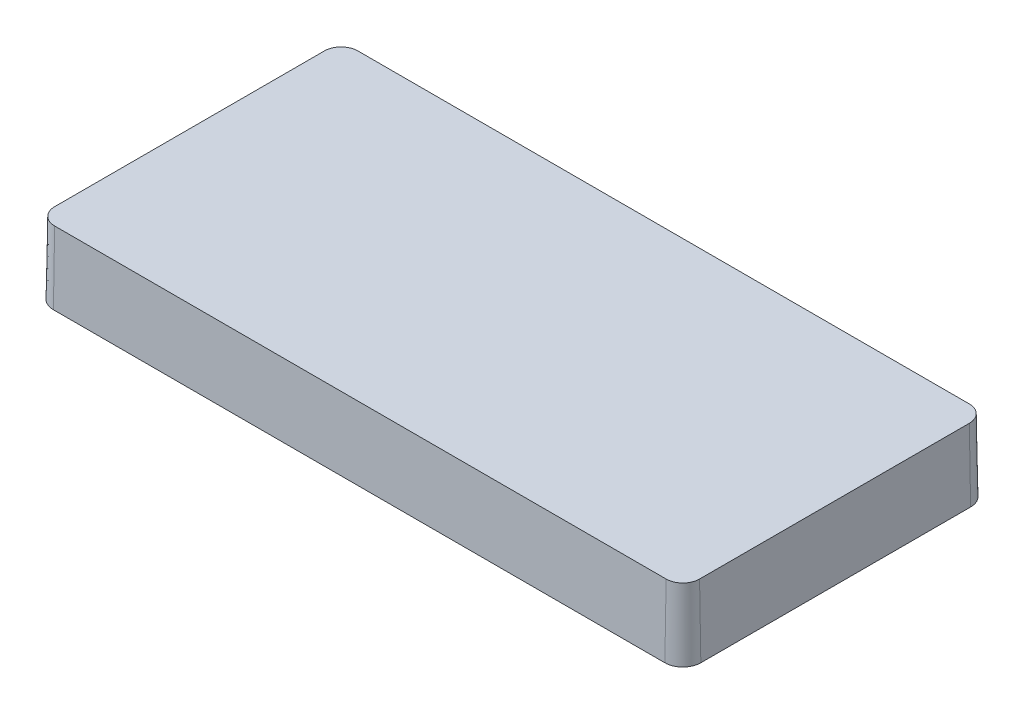
ISO-10303-21;
HEADER;
FILE_DESCRIPTION(('STEP AP214'),'2;1');
FILE_NAME('part.step','',(''),(''),'','','');
FILE_SCHEMA(('AUTOMOTIVE_DESIGN { 1 0 10303 214 1 1 1 1 }'));
ENDSEC;
DATA;
#1=APPLICATION_CONTEXT('core data for automotive mechanical design processes');
#2=APPLICATION_PROTOCOL_DEFINITION('international standard','automotive_design',2000,#1);
#3=PRODUCT_CONTEXT('',#1,'mechanical');
#4=PRODUCT('Part','Part','',(#3));
#5=PRODUCT_RELATED_PRODUCT_CATEGORY('part','',(#4));
#6=PRODUCT_DEFINITION_FORMATION('','',#4);
#7=PRODUCT_DEFINITION_CONTEXT('part definition',#1,'design');
#8=PRODUCT_DEFINITION('design','',#6,#7);
#9=PRODUCT_DEFINITION_SHAPE('','',#8);
#10=(LENGTH_UNIT() NAMED_UNIT(*) SI_UNIT(.MILLI.,.METRE.));
#11=(NAMED_UNIT(*) PLANE_ANGLE_UNIT() SI_UNIT($,.RADIAN.));
#12=(NAMED_UNIT(*) SI_UNIT($,.STERADIAN.) SOLID_ANGLE_UNIT());
#13=UNCERTAINTY_MEASURE_WITH_UNIT(LENGTH_MEASURE(1.E-05),#10,'distance_accuracy_value','');
#14=(GEOMETRIC_REPRESENTATION_CONTEXT(3) GLOBAL_UNCERTAINTY_ASSIGNED_CONTEXT((#13)) GLOBAL_UNIT_ASSIGNED_CONTEXT((#10,
#11,#12)) REPRESENTATION_CONTEXT('',''));
#15=CARTESIAN_POINT('',(0.,0.,0.));
#16=DIRECTION('',(0.,0.,1.));
#17=DIRECTION('',(1.,0.,0.));
#18=AXIS2_PLACEMENT_3D('',#15,#16,#17);
#19=CARTESIAN_POINT('',(-17.,3.5,-7.5));
#20=DIRECTION('',(0.,-1.,0.));
#21=DIRECTION('',(0.,0.,-1.));
#22=AXIS2_PLACEMENT_3D('',#19,#20,#21);
#23=PLANE('',#22);
#24=DIRECTION('',(0.,0.,1.));
#25=VECTOR('',#24,1.);
#26=CARTESIAN_POINT('',(-0.6,3.5,2.93938769133981));
#27=LINE('',#26,#25);
#28=CARTESIAN_POINT('',(-0.599999999999999,3.5,0.6));
#29=VERTEX_POINT('',#28);
#30=CARTESIAN_POINT('',(-0.6,3.5,2.93938769133981));
#31=VERTEX_POINT('',#30);
#32=EDGE_CURVE('E596',#29,#31,#27,.T.);
#33=ORIENTED_EDGE('',*,*,#32,.F.);
#34=DIRECTION('',(1.,0.,0.));
#35=VECTOR('',#34,1.);
#36=CARTESIAN_POINT('',(-2.93938769133981,3.5,0.6));
#37=LINE('',#36,#35);
#38=CARTESIAN_POINT('',(-2.93938769133981,3.5,0.600000000000001));
#39=VERTEX_POINT('',#38);
#40=EDGE_CURVE('E330',#39,#29,#37,.T.);
#41=ORIENTED_EDGE('',*,*,#40,.F.);
#42=CARTESIAN_POINT('',(0.,3.5,0.));
#43=DIRECTION('',(0.,-1.,0.));
#44=DIRECTION('',(0.,0.,-1.));
#45=AXIS2_PLACEMENT_3D('',#42,#43,#44);
#46=CIRCLE('',#45,3.);
#47=EDGE_CURVE('E593',#31,#39,#46,.T.);
#48=ORIENTED_EDGE('',*,*,#47,.F.);
#49=EDGE_LOOP('',(#33,#41,#48));
#50=FACE_BOUND('',#49,.T.);
#51=CARTESIAN_POINT('',(-17.,3.5,-7.5));
#52=DIRECTION('',(0.,-1.,0.));
#53=DIRECTION('',(0.,0.,-1.));
#54=AXIS2_PLACEMENT_3D('',#51,#52,#53);
#55=CIRCLE('',#54,0.438831108729285);
#56=CARTESIAN_POINT('',(-17.,3.5,-7.93883110872928));
#57=VERTEX_POINT('',#56);
#58=CARTESIAN_POINT('',(-17.4388311087293,3.5,-7.5));
#59=VERTEX_POINT('',#58);
#60=EDGE_CURVE('E557',#57,#59,#55,.F.);
#61=ORIENTED_EDGE('',*,*,#60,.F.);
#62=DIRECTION('',(1.,0.,0.));
#63=VECTOR('',#62,1.);
#64=CARTESIAN_POINT('',(-17.,3.5,-7.93883110872928));
#65=LINE('',#64,#63);
#66=CARTESIAN_POINT('',(17.,3.5,-7.93883110872928));
#67=VERTEX_POINT('',#66);
#68=EDGE_CURVE('E560',#67,#57,#65,.F.);
#69=ORIENTED_EDGE('',*,*,#68,.F.);
#70=CARTESIAN_POINT('',(17.,3.5,-7.5));
#71=DIRECTION('',(0.,-1.,0.));
#72=DIRECTION('',(0.,0.,-1.));
#73=AXIS2_PLACEMENT_3D('',#70,#71,#72);
#74=CIRCLE('',#73,0.438831108729287);
#75=CARTESIAN_POINT('',(17.4388311087293,3.5,-7.5));
#76=VERTEX_POINT('',#75);
#77=EDGE_CURVE('E563',#76,#67,#74,.F.);
#78=ORIENTED_EDGE('',*,*,#77,.F.);
#79=DIRECTION('',(0.,0.,1.));
#80=VECTOR('',#79,1.);
#81=CARTESIAN_POINT('',(17.4388311087293,3.5,-7.5));
#82=LINE('',#81,#80);
#83=CARTESIAN_POINT('',(17.4388311087293,3.5,7.5));
#84=VERTEX_POINT('',#83);
#85=EDGE_CURVE('E565',#84,#76,#82,.F.);
#86=ORIENTED_EDGE('',*,*,#85,.F.);
#87=CARTESIAN_POINT('',(17.,3.5,7.5));
#88=DIRECTION('',(0.,-1.,0.));
#89=DIRECTION('',(0.,0.,-1.));
#90=AXIS2_PLACEMENT_3D('',#87,#88,#89);
#91=CIRCLE('',#90,0.438831108729286);
#92=CARTESIAN_POINT('',(17.,3.5,7.93883110872929));
#93=VERTEX_POINT('',#92);
#94=EDGE_CURVE('E570',#93,#84,#91,.F.);
#95=ORIENTED_EDGE('',*,*,#94,.F.);
#96=DIRECTION('',(-1.,0.,0.));
#97=VECTOR('',#96,1.);
#98=CARTESIAN_POINT('',(-17.,3.5,7.93883110872929));
#99=LINE('',#98,#97);
#100=CARTESIAN_POINT('',(-17.,3.5,7.93883110872929));
#101=VERTEX_POINT('',#100);
#102=EDGE_CURVE('E574',#101,#93,#99,.F.);
#103=ORIENTED_EDGE('',*,*,#102,.F.);
#104=CARTESIAN_POINT('',(-17.,3.5,7.5));
#105=DIRECTION('',(0.,-1.,0.));
#106=DIRECTION('',(0.,0.,-1.));
#107=AXIS2_PLACEMENT_3D('',#104,#105,#106);
#108=CIRCLE('',#107,0.438831108729284);
#109=CARTESIAN_POINT('',(-17.4388311087293,3.5,7.5));
#110=VERTEX_POINT('',#109);
#111=EDGE_CURVE('E578',#110,#101,#108,.F.);
#112=ORIENTED_EDGE('',*,*,#111,.F.);
#113=DIRECTION('',(0.,0.,-1.));
#114=VECTOR('',#113,1.);
#115=CARTESIAN_POINT('',(-17.4388311087293,3.5,-7.5));
#116=LINE('',#115,#114);
#117=EDGE_CURVE('E582',#59,#110,#116,.F.);
#118=ORIENTED_EDGE('',*,*,#117,.F.);
#119=EDGE_LOOP('',(#61,#69,#78,#86,#95,#103,#112,#118));
#120=FACE_BOUND('',#119,.T.);
#121=DIRECTION('',(0.,0.,1.));
#122=VECTOR('',#121,1.);
#123=CARTESIAN_POINT('',(-0.599999999999999,3.5,-0.6));
#124=LINE('',#123,#122);
#125=CARTESIAN_POINT('',(-0.6,3.5,-2.93938769133981));
#126=VERTEX_POINT('',#125);
#127=CARTESIAN_POINT('',(-0.6,3.5,-0.6));
#128=VERTEX_POINT('',#127);
#129=EDGE_CURVE('E611',#126,#128,#124,.T.);
#130=ORIENTED_EDGE('',*,*,#129,.F.);
#131=CARTESIAN_POINT('',(0.,3.5,0.));
#132=DIRECTION('',(0.,-1.,0.));
#133=DIRECTION('',(0.,0.,-1.));
#134=AXIS2_PLACEMENT_3D('',#131,#132,#133);
#135=CIRCLE('',#134,3.);
#136=CARTESIAN_POINT('',(-2.93938769133981,3.5,-0.6));
#137=VERTEX_POINT('',#136);
#138=EDGE_CURVE('E294',#137,#126,#135,.T.);
#139=ORIENTED_EDGE('',*,*,#138,.F.);
#140=DIRECTION('',(-1.,0.,0.));
#141=VECTOR('',#140,1.);
#142=CARTESIAN_POINT('',(-2.93938769133981,3.5,-0.6));
#143=LINE('',#142,#141);
#144=EDGE_CURVE('E332',#128,#137,#143,.T.);
#145=ORIENTED_EDGE('',*,*,#144,.F.);
#146=EDGE_LOOP('',(#130,#139,#145));
#147=FACE_BOUND('',#146,.T.);
#148=DIRECTION('',(0.,0.,-1.));
#149=VECTOR('',#148,1.);
#150=CARTESIAN_POINT('',(0.6,3.5,2.93938769133981));
#151=LINE('',#150,#149);
#152=CARTESIAN_POINT('',(0.6,3.5,2.93938769133981));
#153=VERTEX_POINT('',#152);
#154=CARTESIAN_POINT('',(0.6,3.5,0.600000000000001));
#155=VERTEX_POINT('',#154);
#156=EDGE_CURVE('E626',#153,#155,#151,.T.);
#157=ORIENTED_EDGE('',*,*,#156,.F.);
#158=CARTESIAN_POINT('',(0.,3.5,0.));
#159=DIRECTION('',(0.,-1.,0.));
#160=DIRECTION('',(0.,0.,-1.));
#161=AXIS2_PLACEMENT_3D('',#158,#159,#160);
#162=CIRCLE('',#161,3.);
#163=CARTESIAN_POINT('',(2.93938769133981,3.5,0.6));
#164=VERTEX_POINT('',#163);
#165=EDGE_CURVE('E236',#164,#153,#162,.T.);
#166=ORIENTED_EDGE('',*,*,#165,.F.);
#167=DIRECTION('',(1.,0.,0.));
#168=VECTOR('',#167,1.);
#169=CARTESIAN_POINT('',(0.599999999999999,3.5,0.6));
#170=LINE('',#169,#168);
#171=EDGE_CURVE('E295',#155,#164,#170,.T.);
#172=ORIENTED_EDGE('',*,*,#171,.F.);
#173=EDGE_LOOP('',(#157,#166,#172));
#174=FACE_BOUND('',#173,.T.);
#175=DIRECTION('',(-1.,0.,0.));
#176=VECTOR('',#175,1.);
#177=CARTESIAN_POINT('',(0.599999999999999,3.5,-0.6));
#178=LINE('',#177,#176);
#179=CARTESIAN_POINT('',(2.93938769133981,3.5,-0.6));
#180=VERTEX_POINT('',#179);
#181=CARTESIAN_POINT('',(0.600000000000001,3.5,-0.6));
#182=VERTEX_POINT('',#181);
#183=EDGE_CURVE('E230',#180,#182,#178,.T.);
#184=ORIENTED_EDGE('',*,*,#183,.F.);
#185=CARTESIAN_POINT('',(0.,3.5,0.));
#186=DIRECTION('',(0.,-1.,0.));
#187=DIRECTION('',(0.,0.,-1.));
#188=AXIS2_PLACEMENT_3D('',#185,#186,#187);
#189=CIRCLE('',#188,3.);
#190=CARTESIAN_POINT('',(0.6,3.5,-2.93938769133981));
#191=VERTEX_POINT('',#190);
#192=EDGE_CURVE('E240',#191,#180,#189,.T.);
#193=ORIENTED_EDGE('',*,*,#192,.F.);
#194=DIRECTION('',(0.,0.,-1.));
#195=VECTOR('',#194,1.);
#196=CARTESIAN_POINT('',(0.599999999999999,3.5,-0.6));
#197=LINE('',#196,#195);
#198=EDGE_CURVE('E246',#182,#191,#197,.T.);
#199=ORIENTED_EDGE('',*,*,#198,.F.);
#200=EDGE_LOOP('',(#184,#193,#199));
#201=FACE_BOUND('',#200,.T.);
#202=ADVANCED_FACE('F38',(#50,#120,#147,#174,#201),#23,.T.);
#203=CARTESIAN_POINT('',(-17.,0.,-7.5));
#204=DIRECTION('',(0.,-1.,0.));
#205=DIRECTION('',(0.,0.,-1.));
#206=AXIS2_PLACEMENT_3D('',#203,#204,#205);
#207=PLANE('',#206);
#208=CARTESIAN_POINT('',(-17.,0.,-7.5));
#209=DIRECTION('',(0.,1.,0.));
#210=DIRECTION('',(0.,0.,-1.));
#211=AXIS2_PLACEMENT_3D('',#208,#209,#210);
#212=CIRCLE('',#211,1.);
#213=CARTESIAN_POINT('',(-17.,0.,-8.5));
#214=VERTEX_POINT('',#213);
#215=CARTESIAN_POINT('',(-18.,0.,-7.5));
#216=VERTEX_POINT('',#215);
#217=EDGE_CURVE('E523',#214,#216,#212,.T.);
#218=ORIENTED_EDGE('',*,*,#217,.F.);
#219=DIRECTION('',(-1.,0.,0.));
#220=VECTOR('',#219,1.);
#221=CARTESIAN_POINT('',(-17.,0.,-8.5));
#222=LINE('',#221,#220);
#223=CARTESIAN_POINT('',(17.,0.,-8.5));
#224=VERTEX_POINT('',#223);
#225=EDGE_CURVE('E487',#224,#214,#222,.T.);
#226=ORIENTED_EDGE('',*,*,#225,.F.);
#227=CARTESIAN_POINT('',(17.,0.,-7.5));
#228=DIRECTION('',(0.,1.,0.));
#229=DIRECTION('',(0.,0.,1.));
#230=AXIS2_PLACEMENT_3D('',#227,#228,#229);
#231=CIRCLE('',#230,1.);
#232=CARTESIAN_POINT('',(18.,0.,-7.5));
#233=VERTEX_POINT('',#232);
#234=EDGE_CURVE('E485',#233,#224,#231,.T.);
#235=ORIENTED_EDGE('',*,*,#234,.F.);
#236=DIRECTION('',(0.,0.,-1.));
#237=VECTOR('',#236,1.);
#238=CARTESIAN_POINT('',(18.,0.,7.5));
#239=LINE('',#238,#237);
#240=CARTESIAN_POINT('',(18.,0.,7.5));
#241=VERTEX_POINT('',#240);
#242=EDGE_CURVE('E480',#241,#233,#239,.T.);
#243=ORIENTED_EDGE('',*,*,#242,.F.);
#244=CARTESIAN_POINT('',(17.,0.,7.5));
#245=DIRECTION('',(0.,1.,0.));
#246=DIRECTION('',(0.,0.,-1.));
#247=AXIS2_PLACEMENT_3D('',#244,#245,#246);
#248=CIRCLE('',#247,1.);
#249=CARTESIAN_POINT('',(17.,0.,8.5));
#250=VERTEX_POINT('',#249);
#251=EDGE_CURVE('E478',#250,#241,#248,.T.);
#252=ORIENTED_EDGE('',*,*,#251,.F.);
#253=DIRECTION('',(1.,0.,0.));
#254=VECTOR('',#253,1.);
#255=CARTESIAN_POINT('',(-17.,0.,8.5));
#256=LINE('',#255,#254);
#257=CARTESIAN_POINT('',(-17.,0.,8.5));
#258=VERTEX_POINT('',#257);
#259=EDGE_CURVE('E466',#258,#250,#256,.T.);
#260=ORIENTED_EDGE('',*,*,#259,.F.);
#261=CARTESIAN_POINT('',(-17.,0.,7.5));
#262=DIRECTION('',(0.,1.,0.));
#263=DIRECTION('',(0.,0.,-1.));
#264=AXIS2_PLACEMENT_3D('',#261,#262,#263);
#265=CIRCLE('',#264,1.);
#266=CARTESIAN_POINT('',(-18.,0.,7.5));
#267=VERTEX_POINT('',#266);
#268=EDGE_CURVE('E459',#267,#258,#265,.T.);
#269=ORIENTED_EDGE('',*,*,#268,.F.);
#270=DIRECTION('',(0.,0.,1.));
#271=VECTOR('',#270,1.);
#272=CARTESIAN_POINT('',(-18.,0.,7.5));
#273=LINE('',#272,#271);
#274=EDGE_CURVE('E467',#216,#267,#273,.T.);
#275=ORIENTED_EDGE('',*,*,#274,.F.);
#276=EDGE_LOOP('',(#218,#226,#235,#243,#252,#260,#269,#275));
#277=FACE_BOUND('',#276,.T.);
#278=DIRECTION('',(1.,0.,0.));
#279=VECTOR('',#278,1.);
#280=CARTESIAN_POINT('',(-17.,0.,-7.99992383597804));
#281=LINE('',#280,#279);
#282=CARTESIAN_POINT('',(17.,0.,-7.99992383597804));
#283=VERTEX_POINT('',#282);
#284=CARTESIAN_POINT('',(-17.,0.,-7.99992383597804));
#285=VERTEX_POINT('',#284);
#286=EDGE_CURVE('E554',#283,#285,#281,.F.);
#287=ORIENTED_EDGE('',*,*,#286,.T.);
#288=CARTESIAN_POINT('',(-17.,0.,-7.5));
#289=DIRECTION('',(0.,-1.,0.));
#290=DIRECTION('',(0.,0.,-1.));
#291=AXIS2_PLACEMENT_3D('',#288,#289,#290);
#292=CIRCLE('',#291,0.499923835978047);
#293=CARTESIAN_POINT('',(-17.499923835978,0.,-7.5));
#294=VERTEX_POINT('',#293);
#295=EDGE_CURVE('E539',#285,#294,#292,.F.);
#296=ORIENTED_EDGE('',*,*,#295,.T.);
#297=DIRECTION('',(0.,0.,-1.));
#298=VECTOR('',#297,1.);
#299=CARTESIAN_POINT('',(-17.499923835978,0.,-7.5));
#300=LINE('',#299,#298);
#301=CARTESIAN_POINT('',(-17.499923835978,0.,7.5));
#302=VERTEX_POINT('',#301);
#303=EDGE_CURVE('E535',#294,#302,#300,.F.);
#304=ORIENTED_EDGE('',*,*,#303,.T.);
#305=CARTESIAN_POINT('',(-17.,0.,7.5));
#306=DIRECTION('',(0.,-1.,0.));
#307=DIRECTION('',(0.,0.,-1.));
#308=AXIS2_PLACEMENT_3D('',#305,#306,#307);
#309=CIRCLE('',#308,0.499923835978046);
#310=CARTESIAN_POINT('',(-17.,0.,7.99992383597805));
#311=VERTEX_POINT('',#310);
#312=EDGE_CURVE('E538',#302,#311,#309,.F.);
#313=ORIENTED_EDGE('',*,*,#312,.T.);
#314=DIRECTION('',(-1.,0.,0.));
#315=VECTOR('',#314,1.);
#316=CARTESIAN_POINT('',(-17.,0.,7.99992383597805));
#317=LINE('',#316,#315);
#318=CARTESIAN_POINT('',(17.,0.,7.99992383597805));
#319=VERTEX_POINT('',#318);
#320=EDGE_CURVE('E542',#311,#319,#317,.F.);
#321=ORIENTED_EDGE('',*,*,#320,.T.);
#322=CARTESIAN_POINT('',(17.,0.,7.5));
#323=DIRECTION('',(0.,-1.,0.));
#324=DIRECTION('',(0.,0.,-1.));
#325=AXIS2_PLACEMENT_3D('',#322,#323,#324);
#326=CIRCLE('',#325,0.499923835978048);
#327=CARTESIAN_POINT('',(17.499923835978,0.,7.5));
#328=VERTEX_POINT('',#327);
#329=EDGE_CURVE('E545',#319,#328,#326,.F.);
#330=ORIENTED_EDGE('',*,*,#329,.T.);
#331=DIRECTION('',(0.,0.,1.));
#332=VECTOR('',#331,1.);
#333=CARTESIAN_POINT('',(17.499923835978,0.,-7.5));
#334=LINE('',#333,#332);
#335=CARTESIAN_POINT('',(17.499923835978,0.,-7.5));
#336=VERTEX_POINT('',#335);
#337=EDGE_CURVE('E548',#328,#336,#334,.F.);
#338=ORIENTED_EDGE('',*,*,#337,.T.);
#339=CARTESIAN_POINT('',(17.,0.,-7.5));
#340=DIRECTION('',(0.,-1.,0.));
#341=DIRECTION('',(0.,0.,-1.));
#342=AXIS2_PLACEMENT_3D('',#339,#340,#341);
#343=CIRCLE('',#342,0.499923835978049);
#344=EDGE_CURVE('E551',#336,#283,#343,.F.);
#345=ORIENTED_EDGE('',*,*,#344,.T.);
#346=EDGE_LOOP('',(#287,#296,#304,#313,#321,#330,#338,#345));
#347=FACE_BOUND('',#346,.T.);
#348=ADVANCED_FACE('F419',(#277,#347),#207,.T.);
#349=CARTESIAN_POINT('',(-17.,0.,-7.5));
#350=DIRECTION('',(0.,-1.,0.));
#351=DIRECTION('',(0.,0.,-1.));
#352=AXIS2_PLACEMENT_3D('',#349,#350,#351);
#353=CONICAL_SURFACE('',#352,1.,0.0174532925199433);
#354=ORIENTED_EDGE('',*,*,#217,.T.);
#355=DIRECTION('',(-0.0174524064372835,-0.999847695156391,0.));
#356=VECTOR('',#355,1.);
#357=CARTESIAN_POINT('',(-18.,0.,-7.5));
#358=LINE('',#357,#356);
#359=CARTESIAN_POINT('',(-17.9301797402871,4.,-7.5));
#360=VERTEX_POINT('',#359);
#361=EDGE_CURVE('E11',#360,#216,#358,.T.);
#362=ORIENTED_EDGE('',*,*,#361,.F.);
#363=CARTESIAN_POINT('',(-17.,4.,-7.5));
#364=DIRECTION('',(0.,-1.,0.));
#365=DIRECTION('',(0.,0.,-1.));
#366=AXIS2_PLACEMENT_3D('',#363,#364,#365);
#367=CIRCLE('',#366,0.93017974028713);
#368=CARTESIAN_POINT('',(-17.,4.,-8.43017974028713));
#369=VERTEX_POINT('',#368);
#370=EDGE_CURVE('E488',#369,#360,#367,.F.);
#371=ORIENTED_EDGE('',*,*,#370,.F.);
#372=DIRECTION('',(0.,-0.999847695156391,-0.0174524064372835));
#373=VECTOR('',#372,1.);
#374=CARTESIAN_POINT('',(-17.,0.,-8.5));
#375=LINE('',#374,#373);
#376=EDGE_CURVE('E490',#369,#214,#375,.T.);
#377=ORIENTED_EDGE('',*,*,#376,.T.);
#378=EDGE_LOOP('',(#354,#362,#371,#377));
#379=FACE_BOUND('',#378,.T.);
#380=ADVANCED_FACE('F427',(#379),#353,.T.);
#381=CARTESIAN_POINT('',(-18.,0.,7.5));
#382=DIRECTION('',(-0.999847695156391,0.0174524064372835,0.));
#383=DIRECTION('',(-0.0174524064372836,-0.999847695156391,0.));
#384=AXIS2_PLACEMENT_3D('',#381,#382,#383);
#385=PLANE('',#384);
#386=ORIENTED_EDGE('',*,*,#274,.T.);
#387=DIRECTION('',(-0.0174524064372835,-0.999847695156391,0.));
#388=VECTOR('',#387,1.);
#389=CARTESIAN_POINT('',(-18.,0.,7.5));
#390=LINE('',#389,#388);
#391=CARTESIAN_POINT('',(-17.9301797402871,4.,7.5));
#392=VERTEX_POINT('',#391);
#393=EDGE_CURVE('E47',#392,#267,#390,.T.);
#394=ORIENTED_EDGE('',*,*,#393,.F.);
#395=DIRECTION('',(0.,0.,-1.));
#396=VECTOR('',#395,1.);
#397=CARTESIAN_POINT('',(-17.9301797402871,4.,-7.5));
#398=LINE('',#397,#396);
#399=EDGE_CURVE('E506',#360,#392,#398,.F.);
#400=ORIENTED_EDGE('',*,*,#399,.F.);
#401=ORIENTED_EDGE('',*,*,#361,.T.);
#402=EDGE_LOOP('',(#386,#394,#400,#401));
#403=FACE_BOUND('',#402,.T.);
#404=ADVANCED_FACE('F40',(#403),#385,.T.);
#405=CARTESIAN_POINT('',(-17.,0.,7.5));
#406=DIRECTION('',(0.,-1.,0.));
#407=DIRECTION('',(0.,0.,-1.));
#408=AXIS2_PLACEMENT_3D('',#405,#406,#407);
#409=CONICAL_SURFACE('',#408,1.,0.0174532925199433);
#410=ORIENTED_EDGE('',*,*,#268,.T.);
#411=DIRECTION('',(0.,-0.999847695156391,0.0174524064372835));
#412=VECTOR('',#411,1.);
#413=CARTESIAN_POINT('',(-17.,0.,8.5));
#414=LINE('',#413,#412);
#415=CARTESIAN_POINT('',(-17.,4.,8.43017974028713));
#416=VERTEX_POINT('',#415);
#417=EDGE_CURVE('E462',#416,#258,#414,.T.);
#418=ORIENTED_EDGE('',*,*,#417,.F.);
#419=CARTESIAN_POINT('',(-17.,4.,7.5));
#420=DIRECTION('',(0.,-1.,0.));
#421=DIRECTION('',(0.,0.,-1.));
#422=AXIS2_PLACEMENT_3D('',#419,#420,#421);
#423=CIRCLE('',#422,0.930179740287129);
#424=EDGE_CURVE('E508',#392,#416,#423,.F.);
#425=ORIENTED_EDGE('',*,*,#424,.F.);
#426=ORIENTED_EDGE('',*,*,#393,.T.);
#427=EDGE_LOOP('',(#410,#418,#425,#426));
#428=FACE_BOUND('',#427,.T.);
#429=ADVANCED_FACE('F449',(#428),#409,.T.);
#430=CARTESIAN_POINT('',(-17.,0.,8.5));
#431=DIRECTION('',(0.,0.0174524064372835,0.999847695156391));
#432=DIRECTION('',(0.,-0.999847695156391,0.0174524064372835));
#433=AXIS2_PLACEMENT_3D('',#430,#431,#432);
#434=PLANE('',#433);
#435=ORIENTED_EDGE('',*,*,#259,.T.);
#436=DIRECTION('',(0.,-0.999847695156391,0.0174524064372835));
#437=VECTOR('',#436,1.);
#438=CARTESIAN_POINT('',(17.,0.,8.5));
#439=LINE('',#438,#437);
#440=CARTESIAN_POINT('',(17.,4.,8.43017974028713));
#441=VERTEX_POINT('',#440);
#442=EDGE_CURVE('E472',#441,#250,#439,.T.);
#443=ORIENTED_EDGE('',*,*,#442,.F.);
#444=DIRECTION('',(-1.,0.,0.));
#445=VECTOR('',#444,1.);
#446=CARTESIAN_POINT('',(-17.,4.,8.43017974028713));
#447=LINE('',#446,#445);
#448=EDGE_CURVE('E471',#416,#441,#447,.F.);
#449=ORIENTED_EDGE('',*,*,#448,.F.);
#450=ORIENTED_EDGE('',*,*,#417,.T.);
#451=EDGE_LOOP('',(#435,#443,#449,#450));
#452=FACE_BOUND('',#451,.T.);
#453=ADVANCED_FACE('F446',(#452),#434,.T.);
#454=CARTESIAN_POINT('',(17.,0.,7.5));
#455=DIRECTION('',(0.,-1.,0.));
#456=DIRECTION('',(0.,0.,-1.));
#457=AXIS2_PLACEMENT_3D('',#454,#455,#456);
#458=CONICAL_SURFACE('',#457,1.,0.0174532925199433);
#459=ORIENTED_EDGE('',*,*,#251,.T.);
#460=DIRECTION('',(0.0174524064372835,-0.999847695156391,0.));
#461=VECTOR('',#460,1.);
#462=CARTESIAN_POINT('',(18.,0.,7.5));
#463=LINE('',#462,#461);
#464=CARTESIAN_POINT('',(17.9301797402871,4.,7.5));
#465=VERTEX_POINT('',#464);
#466=EDGE_CURVE('E499',#465,#241,#463,.T.);
#467=ORIENTED_EDGE('',*,*,#466,.F.);
#468=CARTESIAN_POINT('',(17.,4.,7.5));
#469=DIRECTION('',(0.,-1.,0.));
#470=DIRECTION('',(0.,0.,-1.));
#471=AXIS2_PLACEMENT_3D('',#468,#469,#470);
#472=CIRCLE('',#471,0.930179740287131);
#473=EDGE_CURVE('E511',#441,#465,#472,.F.);
#474=ORIENTED_EDGE('',*,*,#473,.F.);
#475=ORIENTED_EDGE('',*,*,#442,.T.);
#476=EDGE_LOOP('',(#459,#467,#474,#475));
#477=FACE_BOUND('',#476,.T.);
#478=ADVANCED_FACE('F442',(#477),#458,.T.);
#479=CARTESIAN_POINT('',(18.,0.,7.5));
#480=DIRECTION('',(0.999847695156391,0.0174524064372835,0.));
#481=DIRECTION('',(-0.0174524064372836,0.999847695156391,0.));
#482=AXIS2_PLACEMENT_3D('',#479,#480,#481);
#483=PLANE('',#482);
#484=ORIENTED_EDGE('',*,*,#242,.T.);
#485=DIRECTION('',(0.0174524064372835,-0.999847695156391,0.));
#486=VECTOR('',#485,1.);
#487=CARTESIAN_POINT('',(18.,0.,-7.5));
#488=LINE('',#487,#486);
#489=CARTESIAN_POINT('',(17.9301797402871,4.,-7.5));
#490=VERTEX_POINT('',#489);
#491=EDGE_CURVE('E496',#490,#233,#488,.T.);
#492=ORIENTED_EDGE('',*,*,#491,.F.);
#493=DIRECTION('',(0.,0.,1.));
#494=VECTOR('',#493,1.);
#495=CARTESIAN_POINT('',(17.9301797402871,4.,-7.5));
#496=LINE('',#495,#494);
#497=EDGE_CURVE('E513',#465,#490,#496,.F.);
#498=ORIENTED_EDGE('',*,*,#497,.F.);
#499=ORIENTED_EDGE('',*,*,#466,.T.);
#500=EDGE_LOOP('',(#484,#492,#498,#499));
#501=FACE_BOUND('',#500,.T.);
#502=ADVANCED_FACE('F438',(#501),#483,.T.);
#503=CARTESIAN_POINT('',(17.,0.,-7.5));
#504=DIRECTION('',(0.,-1.,0.));
#505=DIRECTION('',(0.,0.,1.));
#506=AXIS2_PLACEMENT_3D('',#503,#504,#505);
#507=CONICAL_SURFACE('',#506,1.,0.0174532925199433);
#508=ORIENTED_EDGE('',*,*,#234,.T.);
#509=DIRECTION('',(0.,-0.999847695156391,-0.0174524064372835));
#510=VECTOR('',#509,1.);
#511=CARTESIAN_POINT('',(17.,0.,-8.5));
#512=LINE('',#511,#510);
#513=CARTESIAN_POINT('',(17.,4.,-8.43017974028713));
#514=VERTEX_POINT('',#513);
#515=EDGE_CURVE('E493',#514,#224,#512,.T.);
#516=ORIENTED_EDGE('',*,*,#515,.F.);
#517=CARTESIAN_POINT('',(17.,4.,-7.5));
#518=DIRECTION('',(0.,-1.,0.));
#519=DIRECTION('',(0.,0.,-1.));
#520=AXIS2_PLACEMENT_3D('',#517,#518,#519);
#521=CIRCLE('',#520,0.930179740287132);
#522=EDGE_CURVE('E514',#490,#514,#521,.F.);
#523=ORIENTED_EDGE('',*,*,#522,.F.);
#524=ORIENTED_EDGE('',*,*,#491,.T.);
#525=EDGE_LOOP('',(#508,#516,#523,#524));
#526=FACE_BOUND('',#525,.T.);
#527=ADVANCED_FACE('F434',(#526),#507,.T.);
#528=CARTESIAN_POINT('',(-17.,0.,-8.5));
#529=DIRECTION('',(0.,0.0174524064372835,-0.999847695156391));
#530=DIRECTION('',(0.,0.999847695156391,0.0174524064372835));
#531=AXIS2_PLACEMENT_3D('',#528,#529,#530);
#532=PLANE('',#531);
#533=ORIENTED_EDGE('',*,*,#225,.T.);
#534=ORIENTED_EDGE('',*,*,#376,.F.);
#535=DIRECTION('',(1.,0.,0.));
#536=VECTOR('',#535,1.);
#537=CARTESIAN_POINT('',(-17.,4.,-8.43017974028713));
#538=LINE('',#537,#536);
#539=EDGE_CURVE('E42',#514,#369,#538,.F.);
#540=ORIENTED_EDGE('',*,*,#539,.F.);
#541=ORIENTED_EDGE('',*,*,#515,.T.);
#542=EDGE_LOOP('',(#533,#534,#540,#541));
#543=FACE_BOUND('',#542,.T.);
#544=ADVANCED_FACE('F423',(#543),#532,.T.);
#545=CARTESIAN_POINT('',(-17.,4.,-7.5));
#546=DIRECTION('',(0.,-1.,0.));
#547=DIRECTION('',(0.,0.,-1.));
#548=AXIS2_PLACEMENT_3D('',#545,#546,#547);
#549=PLANE('',#548);
#550=ORIENTED_EDGE('',*,*,#370,.T.);
#551=ORIENTED_EDGE('',*,*,#399,.T.);
#552=ORIENTED_EDGE('',*,*,#424,.T.);
#553=ORIENTED_EDGE('',*,*,#448,.T.);
#554=ORIENTED_EDGE('',*,*,#473,.T.);
#555=ORIENTED_EDGE('',*,*,#497,.T.);
#556=ORIENTED_EDGE('',*,*,#522,.T.);
#557=ORIENTED_EDGE('',*,*,#539,.T.);
#558=EDGE_LOOP('',(#550,#551,#552,#553,#554,#555,#556,#557));
#559=FACE_BOUND('',#558,.T.);
#560=ADVANCED_FACE('F389',(#559),#549,.F.);
#561=CARTESIAN_POINT('',(-17.,-0.00872620321864177,-7.5));
#562=DIRECTION('',(0.,-1.,0.));
#563=DIRECTION('',(0.,0.,-1.));
#564=AXIS2_PLACEMENT_3D('',#561,#562,#563);
#565=CONICAL_SURFACE('',#564,0.500076152421805,0.0174532925199433);
#566=ORIENTED_EDGE('',*,*,#295,.F.);
#567=DIRECTION('',(0.,-0.999847695156391,-0.0174524064372835));
#568=VECTOR('',#567,1.);
#569=CARTESIAN_POINT('',(-17.,-0.00872620321864177,-8.0000761524218));
#570=LINE('',#569,#568);
#571=EDGE_CURVE('E562',#57,#285,#570,.T.);
#572=ORIENTED_EDGE('',*,*,#571,.F.);
#573=ORIENTED_EDGE('',*,*,#60,.T.);
#574=DIRECTION('',(-0.0174524064372836,-0.999847695156391,0.));
#575=VECTOR('',#574,1.);
#576=CARTESIAN_POINT('',(-17.5000761524218,-0.00872620321864177,-7.5));
#577=LINE('',#576,#575);
#578=EDGE_CURVE('E529',#59,#294,#577,.T.);
#579=ORIENTED_EDGE('',*,*,#578,.T.);
#580=EDGE_LOOP('',(#566,#572,#573,#579));
#581=FACE_BOUND('',#580,.T.);
#582=ADVANCED_FACE('F385',(#581),#565,.F.);
#583=CARTESIAN_POINT('',(-17.5000761524218,-0.00872620321864177,7.5));
#584=DIRECTION('',(-0.999847695156391,0.0174524064372835,0.));
#585=DIRECTION('',(-0.0174524064372836,-0.999847695156391,0.));
#586=AXIS2_PLACEMENT_3D('',#583,#584,#585);
#587=PLANE('',#586);
#588=ORIENTED_EDGE('',*,*,#303,.F.);
#589=ORIENTED_EDGE('',*,*,#578,.F.);
#590=ORIENTED_EDGE('',*,*,#117,.T.);
#591=DIRECTION('',(-0.0174524064372835,-0.999847695156391,0.));
#592=VECTOR('',#591,1.);
#593=CARTESIAN_POINT('',(-17.5000761524218,-0.00872620321864177,7.5));
#594=LINE('',#593,#592);
#595=EDGE_CURVE('E532',#110,#302,#594,.T.);
#596=ORIENTED_EDGE('',*,*,#595,.T.);
#597=EDGE_LOOP('',(#588,#589,#590,#596));
#598=FACE_BOUND('',#597,.T.);
#599=ADVANCED_FACE('F388',(#598),#587,.F.);
#600=CARTESIAN_POINT('',(-17.,-0.00872620321864177,7.5));
#601=DIRECTION('',(0.,-1.,0.));
#602=DIRECTION('',(0.,0.,-1.));
#603=AXIS2_PLACEMENT_3D('',#600,#601,#602);
#604=CONICAL_SURFACE('',#603,0.500076152421804,0.0174532925199433);
#605=ORIENTED_EDGE('',*,*,#312,.F.);
#606=ORIENTED_EDGE('',*,*,#595,.F.);
#607=ORIENTED_EDGE('',*,*,#111,.T.);
#608=DIRECTION('',(0.,-0.999847695156391,0.0174524064372835));
#609=VECTOR('',#608,1.);
#610=CARTESIAN_POINT('',(-17.,-0.00872620321864177,8.00007615242181));
#611=LINE('',#610,#609);
#612=EDGE_CURVE('E580',#101,#311,#611,.T.);
#613=ORIENTED_EDGE('',*,*,#612,.T.);
#614=EDGE_LOOP('',(#605,#606,#607,#613));
#615=FACE_BOUND('',#614,.T.);
#616=ADVANCED_FACE('F393',(#615),#604,.F.);
#617=CARTESIAN_POINT('',(-17.,-0.00872620321864177,8.00007615242181));
#618=DIRECTION('',(0.,0.0174524064372835,0.999847695156391));
#619=DIRECTION('',(0.,-0.999847695156391,0.0174524064372835));
#620=AXIS2_PLACEMENT_3D('',#617,#618,#619);
#621=PLANE('',#620);
#622=ORIENTED_EDGE('',*,*,#320,.F.);
#623=ORIENTED_EDGE('',*,*,#612,.F.);
#624=ORIENTED_EDGE('',*,*,#102,.T.);
#625=DIRECTION('',(0.,-0.999847695156391,0.0174524064372835));
#626=VECTOR('',#625,1.);
#627=CARTESIAN_POINT('',(17.,-0.00872620321864177,8.00007615242181));
#628=LINE('',#627,#626);
#629=EDGE_CURVE('E576',#93,#319,#628,.T.);
#630=ORIENTED_EDGE('',*,*,#629,.T.);
#631=EDGE_LOOP('',(#622,#623,#624,#630));
#632=FACE_BOUND('',#631,.T.);
#633=ADVANCED_FACE('F397',(#632),#621,.F.);
#634=CARTESIAN_POINT('',(17.,-0.00872620321864177,7.5));
#635=DIRECTION('',(0.,-1.,0.));
#636=DIRECTION('',(0.,0.,-1.));
#637=AXIS2_PLACEMENT_3D('',#634,#635,#636);
#638=CONICAL_SURFACE('',#637,0.500076152421806,0.0174532925199433);
#639=ORIENTED_EDGE('',*,*,#329,.F.);
#640=ORIENTED_EDGE('',*,*,#629,.F.);
#641=ORIENTED_EDGE('',*,*,#94,.T.);
#642=DIRECTION('',(-0.0174524064372836,0.999847695156391,0.));
#643=VECTOR('',#642,1.);
#644=CARTESIAN_POINT('',(17.5000761524218,-0.00872620321864177,7.5));
#645=LINE('',#644,#643);
#646=EDGE_CURVE('E572',#84,#328,#645,.F.);
#647=ORIENTED_EDGE('',*,*,#646,.T.);
#648=EDGE_LOOP('',(#639,#640,#641,#647));
#649=FACE_BOUND('',#648,.T.);
#650=ADVANCED_FACE('F401',(#649),#638,.F.);
#651=CARTESIAN_POINT('',(17.5000761524218,-0.00872620321864177,7.5));
#652=DIRECTION('',(0.999847695156391,0.0174524064372835,0.));
#653=DIRECTION('',(-0.0174524064372836,0.999847695156391,0.));
#654=AXIS2_PLACEMENT_3D('',#651,#652,#653);
#655=PLANE('',#654);
#656=ORIENTED_EDGE('',*,*,#337,.F.);
#657=ORIENTED_EDGE('',*,*,#646,.F.);
#658=ORIENTED_EDGE('',*,*,#85,.T.);
#659=DIRECTION('',(0.0174524064372835,-0.999847695156391,0.));
#660=VECTOR('',#659,1.);
#661=CARTESIAN_POINT('',(17.5000761524218,-0.00872620321864177,-7.5));
#662=LINE('',#661,#660);
#663=EDGE_CURVE('E568',#76,#336,#662,.T.);
#664=ORIENTED_EDGE('',*,*,#663,.T.);
#665=EDGE_LOOP('',(#656,#657,#658,#664));
#666=FACE_BOUND('',#665,.T.);
#667=ADVANCED_FACE('F405',(#666),#655,.F.);
#668=CARTESIAN_POINT('',(17.,-0.00872620321864177,-7.5));
#669=DIRECTION('',(0.,-1.,0.));
#670=DIRECTION('',(0.,0.,1.));
#671=AXIS2_PLACEMENT_3D('',#668,#669,#670);
#672=CONICAL_SURFACE('',#671,0.500076152421807,0.0174532925199433);
#673=ORIENTED_EDGE('',*,*,#344,.F.);
#674=ORIENTED_EDGE('',*,*,#663,.F.);
#675=ORIENTED_EDGE('',*,*,#77,.T.);
#676=DIRECTION('',(0.,0.999847695156391,0.0174524064372835));
#677=VECTOR('',#676,1.);
#678=CARTESIAN_POINT('',(17.,-0.00872620321864177,-8.0000761524218));
#679=LINE('',#678,#677);
#680=EDGE_CURVE('E566',#67,#283,#679,.F.);
#681=ORIENTED_EDGE('',*,*,#680,.T.);
#682=EDGE_LOOP('',(#673,#674,#675,#681));
#683=FACE_BOUND('',#682,.T.);
#684=ADVANCED_FACE('F409',(#683),#672,.F.);
#685=CARTESIAN_POINT('',(-17.,-0.00872620321864177,-8.0000761524218));
#686=DIRECTION('',(0.,0.0174524064372835,-0.999847695156391));
#687=DIRECTION('',(0.,0.999847695156391,0.0174524064372835));
#688=AXIS2_PLACEMENT_3D('',#685,#686,#687);
#689=PLANE('',#688);
#690=ORIENTED_EDGE('',*,*,#286,.F.);
#691=ORIENTED_EDGE('',*,*,#680,.F.);
#692=ORIENTED_EDGE('',*,*,#68,.T.);
#693=ORIENTED_EDGE('',*,*,#571,.T.);
#694=EDGE_LOOP('',(#690,#691,#692,#693));
#695=FACE_BOUND('',#694,.T.);
#696=ADVANCED_FACE('F357',(#695),#689,.F.);
#697=CARTESIAN_POINT('',(-2.93938769133981,3.5,0.6));
#698=DIRECTION('',(0.,-0.0261769483078732,-0.999657324975557));
#699=DIRECTION('',(0.,0.999657324975557,-0.0261769483078732));
#700=AXIS2_PLACEMENT_3D('',#697,#698,#699);
#701=PLANE('',#700);
#702=ORIENTED_EDGE('',*,*,#40,.T.);
#703=DIRECTION('',(0.0261679842649794,0.99931500198837,-0.0261679842649794));
#704=VECTOR('',#703,1.);
#705=CARTESIAN_POINT('',(-0.601601927070591,3.43882487326791,0.601601927070592));
#706=LINE('',#705,#704);
#707=CARTESIAN_POINT('',(-0.744022568630528,-2.,0.744022568630528));
#708=VERTEX_POINT('',#707);
#709=EDGE_CURVE('E372',#708,#29,#706,.T.);
#710=ORIENTED_EDGE('',*,*,#709,.F.);
#711=DIRECTION('',(-1.,0.,0.));
#712=VECTOR('',#711,1.);
#713=CARTESIAN_POINT('',(-2.93938769133981,-2.,0.744022568630528));
#714=LINE('',#713,#712);
#715=CARTESIAN_POINT('',(-2.75736060497357,-2.,0.744022568630528));
#716=VERTEX_POINT('',#715);
#717=EDGE_CURVE('E379',#716,#708,#714,.F.);
#718=ORIENTED_EDGE('',*,*,#717,.F.);
#719=CARTESIAN_POINT('',(-2.75736060497357,-2.,0.744022568630528));
#720=CARTESIAN_POINT('',(-2.78866652584251,-1.08336534427522,0.72001964542812));
#721=CARTESIAN_POINT('',(-2.81948841024152,-0.166714679936977,0.696016303025416));
#722=CARTESIAN_POINT('',(-2.88016410568366,1.66661865339679,0.648008780148562));
#723=CARTESIAN_POINT('',(-2.91001791674007,2.58330132239189,0.624004599674423));
#724=CARTESIAN_POINT('',(-2.93938769133981,3.5,0.6));
#725=B_SPLINE_CURVE_WITH_KNOTS('',3,(#719,#720,#721,#722,#723,#724),.UNSPECIFIED.,.F.,.F.,(4,2,
4),(0.,2.75244823837348,5.50489643900454),.UNSPECIFIED.);
#726=EDGE_CURVE('E362',#716,#39,#725,.T.);
#727=ORIENTED_EDGE('',*,*,#726,.T.);
#728=EDGE_LOOP('',(#702,#710,#718,#727));
#729=FACE_BOUND('',#728,.T.);
#730=ADVANCED_FACE('F352',(#729),#701,.T.);
#731=CARTESIAN_POINT('',(-0.6,3.5,2.93938769133981));
#732=DIRECTION('',(0.999657324975557,-0.0261769483078732,0.));
#733=DIRECTION('',(0.0261769483078732,0.999657324975557,0.));
#734=AXIS2_PLACEMENT_3D('',#731,#732,#733);
#735=PLANE('',#734);
#736=ORIENTED_EDGE('',*,*,#32,.T.);
#737=CARTESIAN_POINT('',(-0.744022568630528,-2.,2.75736060497357));
#738=CARTESIAN_POINT('',(-0.72001964542812,-1.08336534427522,2.78866652584251));
#739=CARTESIAN_POINT('',(-0.696016303025416,-0.166714679936977,2.81948841024152));
#740=CARTESIAN_POINT('',(-0.648008780148562,1.66661865339679,2.88016410568366));
#741=CARTESIAN_POINT('',(-0.624004599674423,2.58330132239189,2.91001791674007));
#742=CARTESIAN_POINT('',(-0.6,3.5,2.93938769133981));
#743=B_SPLINE_CURVE_WITH_KNOTS('',3,(#737,#738,#739,#740,#741,#742),.UNSPECIFIED.,.F.,.F.,(4,2,
4),(0.,2.75244823837348,5.50489643900454),.UNSPECIFIED.);
#744=CARTESIAN_POINT('',(-0.744022568630528,-2.,2.75736060497357));
#745=VERTEX_POINT('',#744);
#746=EDGE_CURVE('E370',#745,#31,#743,.T.);
#747=ORIENTED_EDGE('',*,*,#746,.F.);
#748=DIRECTION('',(0.,0.,-1.));
#749=VECTOR('',#748,1.);
#750=CARTESIAN_POINT('',(-0.744022568630529,-2.,2.93938769133981));
#751=LINE('',#750,#749);
#752=EDGE_CURVE('E590',#708,#745,#751,.F.);
#753=ORIENTED_EDGE('',*,*,#752,.F.);
#754=ORIENTED_EDGE('',*,*,#709,.T.);
#755=EDGE_LOOP('',(#736,#747,#753,#754));
#756=FACE_BOUND('',#755,.T.);
#757=ADVANCED_FACE('F356',(#756),#735,.T.);
#758=CARTESIAN_POINT('',(0.,3.5,0.));
#759=DIRECTION('',(0.,1.,0.));
#760=DIRECTION('',(0.,0.,-1.));
#761=AXIS2_PLACEMENT_3D('',#758,#759,#760);
#762=CONICAL_SURFACE('',#761,3.,0.026179938779915);
#763=ORIENTED_EDGE('',*,*,#47,.T.);
#764=ORIENTED_EDGE('',*,*,#726,.F.);
#765=CARTESIAN_POINT('',(0.,-2.,0.));
#766=DIRECTION('',(0.,-1.,0.));
#767=DIRECTION('',(0.,0.,-1.));
#768=AXIS2_PLACEMENT_3D('',#765,#766,#767);
#769=CIRCLE('',#768,2.85597743136947);
#770=EDGE_CURVE('E371',#745,#716,#769,.T.);
#771=ORIENTED_EDGE('',*,*,#770,.F.);
#772=ORIENTED_EDGE('',*,*,#746,.T.);
#773=EDGE_LOOP('',(#763,#764,#771,#772));
#774=FACE_BOUND('',#773,.T.);
#775=ADVANCED_FACE('F350',(#774),#762,.T.);
#776=CARTESIAN_POINT('',(0.,-2.,0.));
#777=DIRECTION('',(0.,-1.,0.));
#778=DIRECTION('',(0.,0.,-1.));
#779=AXIS2_PLACEMENT_3D('',#776,#777,#778);
#780=PLANE('',#779);
#781=ORIENTED_EDGE('',*,*,#717,.T.);
#782=ORIENTED_EDGE('',*,*,#752,.T.);
#783=ORIENTED_EDGE('',*,*,#770,.T.);
#784=EDGE_LOOP('',(#781,#782,#783));
#785=FACE_BOUND('',#784,.T.);
#786=ADVANCED_FACE('F347',(#785),#780,.T.);
#787=CARTESIAN_POINT('',(0.,3.5,0.));
#788=DIRECTION('',(0.,1.,0.));
#789=DIRECTION('',(0.,0.,-1.));
#790=AXIS2_PLACEMENT_3D('',#787,#788,#789);
#791=CONICAL_SURFACE('',#790,3.,0.026179938779915);
#792=ORIENTED_EDGE('',*,*,#138,.T.);
#793=CARTESIAN_POINT('',(-0.744022568630528,-2.,-2.75736060497357));
#794=CARTESIAN_POINT('',(-0.72001964542812,-1.08336534427522,-2.78866652584251));
#795=CARTESIAN_POINT('',(-0.696016303025416,-0.166714679936977,-2.81948841024152));
#796=CARTESIAN_POINT('',(-0.648008780148562,1.66661865339679,-2.88016410568366));
#797=CARTESIAN_POINT('',(-0.624004599674423,2.58330132239189,-2.91001791674007));
#798=CARTESIAN_POINT('',(-0.6,3.5,-2.93938769133981));
#799=B_SPLINE_CURVE_WITH_KNOTS('',3,(#793,#794,#795,#796,#797,#798),.UNSPECIFIED.,.F.,.F.,(4,2,
4),(0.,2.75244823837348,5.50489643900454),.UNSPECIFIED.);
#800=CARTESIAN_POINT('',(-0.744022568630528,-2.,-2.75736060497357));
#801=VERTEX_POINT('',#800);
#802=EDGE_CURVE('E323',#801,#126,#799,.T.);
#803=ORIENTED_EDGE('',*,*,#802,.F.);
#804=CARTESIAN_POINT('',(0.,-2.,0.));
#805=DIRECTION('',(0.,-1.,0.));
#806=DIRECTION('',(0.,0.,-1.));
#807=AXIS2_PLACEMENT_3D('',#804,#805,#806);
#808=CIRCLE('',#807,2.85597743136947);
#809=CARTESIAN_POINT('',(-2.75736060497357,-2.,-0.744022568630528));
#810=VERTEX_POINT('',#809);
#811=EDGE_CURVE('E607',#810,#801,#808,.T.);
#812=ORIENTED_EDGE('',*,*,#811,.F.);
#813=CARTESIAN_POINT('',(-2.75736060497357,-2.,-0.744022568630528));
#814=CARTESIAN_POINT('',(-2.78866652584251,-1.08336534427522,-0.72001964542812));
#815=CARTESIAN_POINT('',(-2.81948841024152,-0.166714679936977,-0.696016303025416));
#816=CARTESIAN_POINT('',(-2.88016410568366,1.66661865339679,-0.648008780148562));
#817=CARTESIAN_POINT('',(-2.91001791674007,2.58330132239189,-0.624004599674423));
#818=CARTESIAN_POINT('',(-2.93938769133981,3.5,-0.6));
#819=B_SPLINE_CURVE_WITH_KNOTS('',3,(#813,#814,#815,#816,#817,#818),.UNSPECIFIED.,.F.,.F.,(4,2,
4),(0.,2.75244823837348,5.50489643900454),.UNSPECIFIED.);
#820=EDGE_CURVE('E334',#810,#137,#819,.T.);
#821=ORIENTED_EDGE('',*,*,#820,.T.);
#822=EDGE_LOOP('',(#792,#803,#812,#821));
#823=FACE_BOUND('',#822,.T.);
#824=ADVANCED_FACE('F318',(#823),#791,.T.);
#825=CARTESIAN_POINT('',(-0.599999999999999,3.5,-0.6));
#826=DIRECTION('',(0.999657324975557,-0.0261769483078732,0.));
#827=DIRECTION('',(0.0261769483078732,0.999657324975557,0.));
#828=AXIS2_PLACEMENT_3D('',#825,#826,#827);
#829=PLANE('',#828);
#830=ORIENTED_EDGE('',*,*,#129,.T.);
#831=DIRECTION('',(0.0261679842649794,0.99931500198837,0.0261679842649794));
#832=VECTOR('',#831,1.);
#833=CARTESIAN_POINT('',(-0.601601927070591,3.43882487326791,-0.601601927070591));
#834=LINE('',#833,#832);
#835=CARTESIAN_POINT('',(-0.744022568630528,-2.,-0.744022568630528));
#836=VERTEX_POINT('',#835);
#837=EDGE_CURVE('E331',#836,#128,#834,.T.);
#838=ORIENTED_EDGE('',*,*,#837,.F.);
#839=DIRECTION('',(0.,0.,-1.));
#840=VECTOR('',#839,1.);
#841=CARTESIAN_POINT('',(-0.744022568630528,-2.,-0.6));
#842=LINE('',#841,#840);
#843=EDGE_CURVE('E606',#801,#836,#842,.F.);
#844=ORIENTED_EDGE('',*,*,#843,.F.);
#845=ORIENTED_EDGE('',*,*,#802,.T.);
#846=EDGE_LOOP('',(#830,#838,#844,#845));
#847=FACE_BOUND('',#846,.T.);
#848=ADVANCED_FACE('F314',(#847),#829,.T.);
#849=CARTESIAN_POINT('',(-2.93938769133981,3.5,-0.6));
#850=DIRECTION('',(0.,-0.0261769483078732,0.999657324975557));
#851=DIRECTION('',(0.,-0.999657324975557,-0.0261769483078732));
#852=AXIS2_PLACEMENT_3D('',#849,#850,#851);
#853=PLANE('',#852);
#854=ORIENTED_EDGE('',*,*,#144,.T.);
#855=ORIENTED_EDGE('',*,*,#820,.F.);
#856=DIRECTION('',(1.,0.,0.));
#857=VECTOR('',#856,1.);
#858=CARTESIAN_POINT('',(-2.93938769133981,-2.,-0.744022568630528));
#859=LINE('',#858,#857);
#860=EDGE_CURVE('E341',#836,#810,#859,.F.);
#861=ORIENTED_EDGE('',*,*,#860,.F.);
#862=ORIENTED_EDGE('',*,*,#837,.T.);
#863=EDGE_LOOP('',(#854,#855,#861,#862));
#864=FACE_BOUND('',#863,.T.);
#865=ADVANCED_FACE('F312',(#864),#853,.T.);
#866=CARTESIAN_POINT('',(0.,-2.,0.));
#867=DIRECTION('',(0.,-1.,0.));
#868=DIRECTION('',(0.,0.,-1.));
#869=AXIS2_PLACEMENT_3D('',#866,#867,#868);
#870=PLANE('',#869);
#871=ORIENTED_EDGE('',*,*,#811,.T.);
#872=ORIENTED_EDGE('',*,*,#843,.T.);
#873=ORIENTED_EDGE('',*,*,#860,.T.);
#874=EDGE_LOOP('',(#871,#872,#873));
#875=FACE_BOUND('',#874,.T.);
#876=ADVANCED_FACE('F309',(#875),#870,.T.);
#877=CARTESIAN_POINT('',(0.,3.5,0.));
#878=DIRECTION('',(0.,1.,0.));
#879=DIRECTION('',(0.,0.,-1.));
#880=AXIS2_PLACEMENT_3D('',#877,#878,#879);
#881=CONICAL_SURFACE('',#880,3.,0.026179938779915);
#882=ORIENTED_EDGE('',*,*,#165,.T.);
#883=CARTESIAN_POINT('',(0.744022568630528,-2.,2.75736060497357));
#884=CARTESIAN_POINT('',(0.72001964542812,-1.08336534427522,2.78866652584251));
#885=CARTESIAN_POINT('',(0.696016303025416,-0.166714679936977,2.81948841024152));
#886=CARTESIAN_POINT('',(0.648008780148562,1.66661865339679,2.88016410568366));
#887=CARTESIAN_POINT('',(0.624004599674423,2.58330132239189,2.91001791674007));
#888=CARTESIAN_POINT('',(0.6,3.5,2.93938769133981));
#889=B_SPLINE_CURVE_WITH_KNOTS('',3,(#883,#884,#885,#886,#887,#888),.UNSPECIFIED.,.F.,.F.,(4,2,
4),(0.,2.75244823837348,5.50489643900454),.UNSPECIFIED.);
#890=CARTESIAN_POINT('',(0.744022568630528,-2.,2.75736060497357));
#891=VERTEX_POINT('',#890);
#892=EDGE_CURVE('E287',#891,#153,#889,.T.);
#893=ORIENTED_EDGE('',*,*,#892,.F.);
#894=CARTESIAN_POINT('',(0.,-2.,0.));
#895=DIRECTION('',(0.,-1.,0.));
#896=DIRECTION('',(0.,0.,-1.));
#897=AXIS2_PLACEMENT_3D('',#894,#895,#896);
#898=CIRCLE('',#897,2.85597743136947);
#899=CARTESIAN_POINT('',(2.75736060497357,-2.,0.744022568630528));
#900=VERTEX_POINT('',#899);
#901=EDGE_CURVE('E622',#900,#891,#898,.T.);
#902=ORIENTED_EDGE('',*,*,#901,.F.);
#903=CARTESIAN_POINT('',(2.75736060497357,-2.,0.744022568630528));
#904=CARTESIAN_POINT('',(2.78866652584251,-1.08336534427522,0.72001964542812));
#905=CARTESIAN_POINT('',(2.81948841024152,-0.166714679936977,0.696016303025416));
#906=CARTESIAN_POINT('',(2.88016410568366,1.66661865339679,0.648008780148562));
#907=CARTESIAN_POINT('',(2.91001791674007,2.58330132239189,0.624004599674423));
#908=CARTESIAN_POINT('',(2.93938769133981,3.5,0.6));
#909=B_SPLINE_CURVE_WITH_KNOTS('',3,(#903,#904,#905,#906,#907,#908),.UNSPECIFIED.,.F.,.F.,(4,2,
4),(0.,2.75244823837348,5.50489643900454),.UNSPECIFIED.);
#910=EDGE_CURVE('E297',#900,#164,#909,.T.);
#911=ORIENTED_EDGE('',*,*,#910,.T.);
#912=EDGE_LOOP('',(#882,#893,#902,#911));
#913=FACE_BOUND('',#912,.T.);
#914=ADVANCED_FACE('F282',(#913),#881,.T.);
#915=CARTESIAN_POINT('',(0.6,3.5,2.93938769133981));
#916=DIRECTION('',(-0.999657324975557,-0.0261769483078732,0.));
#917=DIRECTION('',(0.0261769483078732,-0.999657324975557,0.));
#918=AXIS2_PLACEMENT_3D('',#915,#916,#917);
#919=PLANE('',#918);
#920=ORIENTED_EDGE('',*,*,#156,.T.);
#921=DIRECTION('',(-0.0261679842649794,0.99931500198837,-0.0261679842649794));
#922=VECTOR('',#921,1.);
#923=CARTESIAN_POINT('',(0.599999999999999,3.5,0.6));
#924=LINE('',#923,#922);
#925=CARTESIAN_POINT('',(0.744022568630528,-2.,0.744022568630528));
#926=VERTEX_POINT('',#925);
#927=EDGE_CURVE('E63',#926,#155,#924,.T.);
#928=ORIENTED_EDGE('',*,*,#927,.F.);
#929=DIRECTION('',(0.,0.,1.));
#930=VECTOR('',#929,1.);
#931=CARTESIAN_POINT('',(0.744022568630529,-2.,2.93938769133981));
#932=LINE('',#931,#930);
#933=EDGE_CURVE('E621',#891,#926,#932,.F.);
#934=ORIENTED_EDGE('',*,*,#933,.F.);
#935=ORIENTED_EDGE('',*,*,#892,.T.);
#936=EDGE_LOOP('',(#920,#928,#934,#935));
#937=FACE_BOUND('',#936,.T.);
#938=ADVANCED_FACE('F278',(#937),#919,.T.);
#939=CARTESIAN_POINT('',(0.599999999999999,3.5,0.6));
#940=DIRECTION('',(0.,-0.0261769483078732,-0.999657324975557));
#941=DIRECTION('',(0.,0.999657324975557,-0.0261769483078732));
#942=AXIS2_PLACEMENT_3D('',#939,#940,#941);
#943=PLANE('',#942);
#944=ORIENTED_EDGE('',*,*,#171,.T.);
#945=ORIENTED_EDGE('',*,*,#910,.F.);
#946=DIRECTION('',(-1.,0.,0.));
#947=VECTOR('',#946,1.);
#948=CARTESIAN_POINT('',(0.599999999999999,-2.,0.744022568630528));
#949=LINE('',#948,#947);
#950=EDGE_CURVE('E304',#926,#900,#949,.F.);
#951=ORIENTED_EDGE('',*,*,#950,.F.);
#952=ORIENTED_EDGE('',*,*,#927,.T.);
#953=EDGE_LOOP('',(#944,#945,#951,#952));
#954=FACE_BOUND('',#953,.T.);
#955=ADVANCED_FACE('F276',(#954),#943,.T.);
#956=CARTESIAN_POINT('',(0.,-2.,0.));
#957=DIRECTION('',(0.,-1.,0.));
#958=DIRECTION('',(0.,0.,-1.));
#959=AXIS2_PLACEMENT_3D('',#956,#957,#958);
#960=PLANE('',#959);
#961=ORIENTED_EDGE('',*,*,#901,.T.);
#962=ORIENTED_EDGE('',*,*,#933,.T.);
#963=ORIENTED_EDGE('',*,*,#950,.T.);
#964=EDGE_LOOP('',(#961,#962,#963));
#965=FACE_BOUND('',#964,.T.);
#966=ADVANCED_FACE('F267',(#965),#960,.T.);
#967=CARTESIAN_POINT('',(0.,3.5,0.));
#968=DIRECTION('',(0.,1.,0.));
#969=DIRECTION('',(0.,0.,-1.));
#970=AXIS2_PLACEMENT_3D('',#967,#968,#969);
#971=CONICAL_SURFACE('',#970,3.,0.026179938779915);
#972=ORIENTED_EDGE('',*,*,#192,.T.);
#973=CARTESIAN_POINT('',(2.75736060497357,-2.,-0.744022568630528));
#974=CARTESIAN_POINT('',(2.78866652584251,-1.08336534427522,-0.72001964542812));
#975=CARTESIAN_POINT('',(2.81948841024152,-0.166714679936977,-0.696016303025416));
#976=CARTESIAN_POINT('',(2.88016410568366,1.66661865339679,-0.648008780148562));
#977=CARTESIAN_POINT('',(2.91001791674007,2.58330132239189,-0.624004599674423));
#978=CARTESIAN_POINT('',(2.93938769133981,3.5,-0.6));
#979=B_SPLINE_CURVE_WITH_KNOTS('',3,(#973,#974,#975,#976,#977,#978),.UNSPECIFIED.,.F.,.F.,(4,2,
4),(0.,2.75244823837348,5.50489643900454),.UNSPECIFIED.);
#980=CARTESIAN_POINT('',(2.75736060497357,-2.,-0.744022568630528));
#981=VERTEX_POINT('',#980);
#982=EDGE_CURVE('E226',#981,#180,#979,.T.);
#983=ORIENTED_EDGE('',*,*,#982,.F.);
#984=CARTESIAN_POINT('',(0.,-2.,0.));
#985=DIRECTION('',(0.,-1.,0.));
#986=DIRECTION('',(0.,0.,-1.));
#987=AXIS2_PLACEMENT_3D('',#984,#985,#986);
#988=CIRCLE('',#987,2.85597743136947);
#989=CARTESIAN_POINT('',(0.744022568630528,-2.,-2.75736060497357));
#990=VERTEX_POINT('',#989);
#991=EDGE_CURVE('E248',#990,#981,#988,.T.);
#992=ORIENTED_EDGE('',*,*,#991,.F.);
#993=CARTESIAN_POINT('',(0.744022568630528,-2.,-2.75736060497357));
#994=CARTESIAN_POINT('',(0.72001964542812,-1.08336534427522,-2.78866652584251));
#995=CARTESIAN_POINT('',(0.696016303025416,-0.166714679936977,-2.81948841024152));
#996=CARTESIAN_POINT('',(0.648008780148562,1.66661865339679,-2.88016410568366));
#997=CARTESIAN_POINT('',(0.624004599674423,2.58330132239189,-2.91001791674007));
#998=CARTESIAN_POINT('',(0.6,3.5,-2.93938769133981));
#999=B_SPLINE_CURVE_WITH_KNOTS('',3,(#993,#994,#995,#996,#997,#998),.UNSPECIFIED.,.F.,.F.,(4,2,
4),(0.,2.75244823837348,5.50489643900454),.UNSPECIFIED.);
#1000=EDGE_CURVE('E243',#990,#191,#999,.T.);
#1001=ORIENTED_EDGE('',*,*,#1000,.T.);
#1002=EDGE_LOOP('',(#972,#983,#992,#1001));
#1003=FACE_BOUND('',#1002,.T.);
#1004=ADVANCED_FACE('F241',(#1003),#971,.T.);
#1005=CARTESIAN_POINT('',(0.599999999999999,3.5,-0.6));
#1006=DIRECTION('',(0.,-0.0261769483078732,0.999657324975557));
#1007=DIRECTION('',(0.,-0.999657324975557,-0.0261769483078732));
#1008=AXIS2_PLACEMENT_3D('',#1005,#1006,#1007);
#1009=PLANE('',#1008);
#1010=ORIENTED_EDGE('',*,*,#183,.T.);
#1011=DIRECTION('',(-0.0261679842649794,0.99931500198837,0.0261679842649794));
#1012=VECTOR('',#1011,1.);
#1013=CARTESIAN_POINT('',(0.599999999999999,3.5,-0.6));
#1014=LINE('',#1013,#1012);
#1015=CARTESIAN_POINT('',(0.744022568630528,-2.,-0.744022568630528));
#1016=VERTEX_POINT('',#1015);
#1017=EDGE_CURVE('E55',#1016,#182,#1014,.T.);
#1018=ORIENTED_EDGE('',*,*,#1017,.F.);
#1019=DIRECTION('',(1.,0.,0.));
#1020=VECTOR('',#1019,1.);
#1021=CARTESIAN_POINT('',(0.599999999999999,-2.,-0.744022568630528));
#1022=LINE('',#1021,#1020);
#1023=EDGE_CURVE('E232',#981,#1016,#1022,.F.);
#1024=ORIENTED_EDGE('',*,*,#1023,.F.);
#1025=ORIENTED_EDGE('',*,*,#982,.T.);
#1026=EDGE_LOOP('',(#1010,#1018,#1024,#1025));
#1027=FACE_BOUND('',#1026,.T.);
#1028=ADVANCED_FACE('F228',(#1027),#1009,.T.);
#1029=CARTESIAN_POINT('',(0.599999999999999,3.5,-0.6));
#1030=DIRECTION('',(-0.999657324975557,-0.0261769483078732,0.));
#1031=DIRECTION('',(0.0261769483078732,-0.999657324975557,0.));
#1032=AXIS2_PLACEMENT_3D('',#1029,#1030,#1031);
#1033=PLANE('',#1032);
#1034=ORIENTED_EDGE('',*,*,#198,.T.);
#1035=ORIENTED_EDGE('',*,*,#1000,.F.);
#1036=DIRECTION('',(0.,0.,1.));
#1037=VECTOR('',#1036,1.);
#1038=CARTESIAN_POINT('',(0.744022568630528,-2.,-0.6));
#1039=LINE('',#1038,#1037);
#1040=EDGE_CURVE('E633',#1016,#990,#1039,.F.);
#1041=ORIENTED_EDGE('',*,*,#1040,.F.);
#1042=ORIENTED_EDGE('',*,*,#1017,.T.);
#1043=EDGE_LOOP('',(#1034,#1035,#1041,#1042));
#1044=FACE_BOUND('',#1043,.T.);
#1045=ADVANCED_FACE('F268',(#1044),#1033,.T.);
#1046=CARTESIAN_POINT('',(0.,-2.,0.));
#1047=DIRECTION('',(0.,-1.,0.));
#1048=DIRECTION('',(0.,0.,-1.));
#1049=AXIS2_PLACEMENT_3D('',#1046,#1047,#1048);
#1050=PLANE('',#1049);
#1051=ORIENTED_EDGE('',*,*,#991,.T.);
#1052=ORIENTED_EDGE('',*,*,#1023,.T.);
#1053=ORIENTED_EDGE('',*,*,#1040,.T.);
#1054=EDGE_LOOP('',(#1051,#1052,#1053));
#1055=FACE_BOUND('',#1054,.T.);
#1056=ADVANCED_FACE('F273',(#1055),#1050,.T.);
#1057=CLOSED_SHELL('',(#202,#348,#380,#404,#429,#453,#478,#502,#527,#544,#560,#582,#599,#616,
#633,#650,#667,#684,#696,#730,#757,#775,#786,#824,#848,#865,#876,#914,#938,#955,#966,#1004,
#1028,#1045,#1056));
#1058=MANIFOLD_SOLID_BREP('B2',#1057);
#1059=ADVANCED_BREP_SHAPE_REPRESENTATION('',(#18,#1058),#14);
#1060=SHAPE_DEFINITION_REPRESENTATION(#9,#1059);
ENDSEC;
END-ISO-10303-21;
